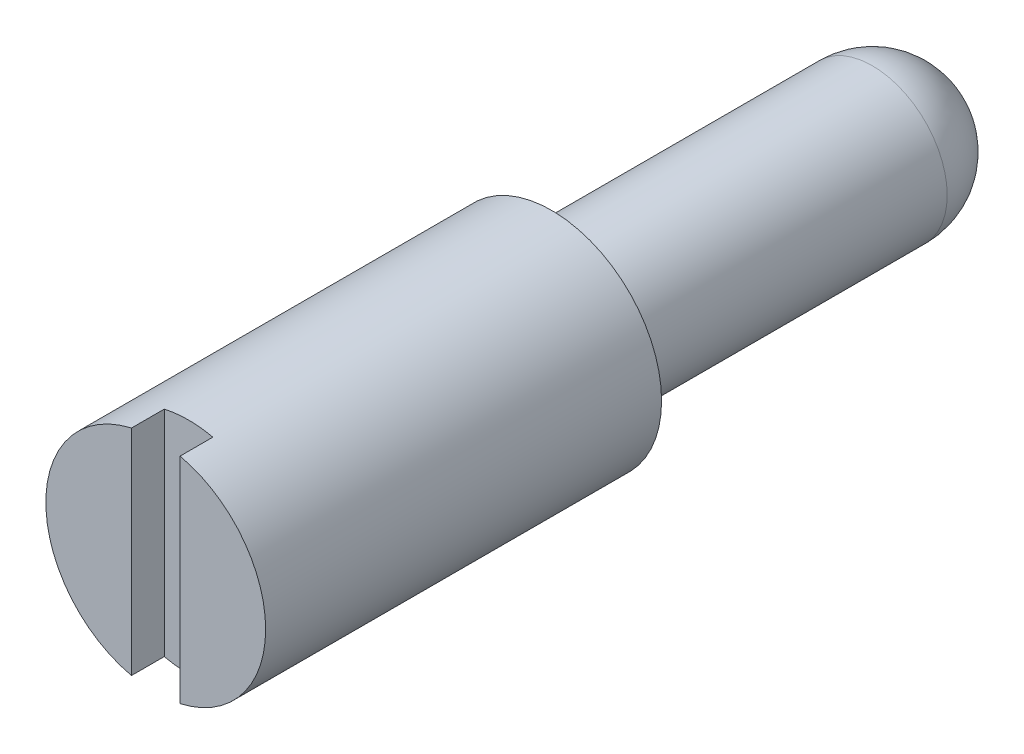
ISO-10303-21;
HEADER;
FILE_DESCRIPTION(('STEP AP214'),'2;1');
FILE_NAME('part.step','',(''),(''),'','','');
FILE_SCHEMA(('AUTOMOTIVE_DESIGN { 1 0 10303 214 1 1 1 1 }'));
ENDSEC;
DATA;
#1=APPLICATION_CONTEXT('core data for automotive mechanical design processes');
#2=APPLICATION_PROTOCOL_DEFINITION('international standard','automotive_design',2000,#1);
#3=PRODUCT_CONTEXT('',#1,'mechanical');
#4=PRODUCT('Part','Part','',(#3));
#5=PRODUCT_RELATED_PRODUCT_CATEGORY('part','',(#4));
#6=PRODUCT_DEFINITION_FORMATION('','',#4);
#7=PRODUCT_DEFINITION_CONTEXT('part definition',#1,'design');
#8=PRODUCT_DEFINITION('design','',#6,#7);
#9=PRODUCT_DEFINITION_SHAPE('','',#8);
#10=(LENGTH_UNIT() NAMED_UNIT(*) SI_UNIT(.MILLI.,.METRE.));
#11=(NAMED_UNIT(*) PLANE_ANGLE_UNIT() SI_UNIT($,.RADIAN.));
#12=(NAMED_UNIT(*) SI_UNIT($,.STERADIAN.) SOLID_ANGLE_UNIT());
#13=UNCERTAINTY_MEASURE_WITH_UNIT(LENGTH_MEASURE(1.E-05),#10,'distance_accuracy_value','');
#14=(GEOMETRIC_REPRESENTATION_CONTEXT(3) GLOBAL_UNCERTAINTY_ASSIGNED_CONTEXT((#13)) GLOBAL_UNIT_ASSIGNED_CONTEXT((#10,
#11,#12)) REPRESENTATION_CONTEXT('',''));
#15=CARTESIAN_POINT('',(0.,0.,0.));
#16=DIRECTION('',(0.,0.,1.));
#17=DIRECTION('',(1.,0.,0.));
#18=AXIS2_PLACEMENT_3D('',#15,#16,#17);
#19=CARTESIAN_POINT('',(0.,0.,0.));
#20=DIRECTION('',(0.,0.,1.));
#21=DIRECTION('',(1.,0.,0.));
#22=AXIS2_PLACEMENT_3D('',#19,#20,#21);
#23=PLANE('',#22);
#24=DIRECTION('',(0.,1.,0.));
#25=VECTOR('',#24,1.);
#26=CARTESIAN_POINT('',(-0.585,-2.64537992930195,0.));
#27=LINE('',#26,#25);
#28=CARTESIAN_POINT('',(-0.585,-2.57988565063523,0.));
#29=VERTEX_POINT('',#28);
#30=CARTESIAN_POINT('',(-0.585,2.57988565063523,0.));
#31=VERTEX_POINT('',#30);
#32=EDGE_CURVE('E99',#29,#31,#27,.T.);
#33=ORIENTED_EDGE('',*,*,#32,.T.);
#34=CARTESIAN_POINT('',(0.,0.,0.));
#35=DIRECTION('',(0.,0.,1.));
#36=DIRECTION('',(1.,0.,0.));
#37=AXIS2_PLACEMENT_3D('',#34,#35,#36);
#38=CIRCLE('',#37,2.64537992930195);
#39=EDGE_CURVE('E88',#31,#29,#38,.T.);
#40=ORIENTED_EDGE('',*,*,#39,.T.);
#41=EDGE_LOOP('',(#33,#40));
#42=FACE_BOUND('',#41,.T.);
#43=ADVANCED_FACE('F37',(#42),#23,.T.);
#44=CARTESIAN_POINT('',(0.,0.,-17.25));
#45=DIRECTION('',(0.,0.,1.));
#46=DIRECTION('',(1.,0.,0.));
#47=AXIS2_PLACEMENT_3D('',#44,#45,#46);
#48=SPHERICAL_SURFACE('',#47,1.8);
#49=CARTESIAN_POINT('',(0.,0.,-17.25));
#50=DIRECTION('',(0.,0.,1.));
#51=DIRECTION('',(1.,0.,0.));
#52=AXIS2_PLACEMENT_3D('',#49,#50,#51);
#53=CIRCLE('',#52,1.8);
#54=CARTESIAN_POINT('',(1.8,0.,-17.25));
#55=VERTEX_POINT('',#54);
#56=EDGE_CURVE('E104',#55,#55,#53,.T.);
#57=ORIENTED_EDGE('',*,*,#56,.F.);
#58=EDGE_LOOP('',(#57));
#59=FACE_BOUND('',#58,.T.);
#60=ADVANCED_FACE('F39',(#59),#48,.T.);
#61=DIRECTION('',(0.,1.,0.));
#62=VECTOR('',#61,1.);
#63=CARTESIAN_POINT('',(0.585,-2.64537992930195,0.));
#64=LINE('',#63,#62);
#65=CARTESIAN_POINT('',(0.585,-2.57988565063523,0.));
#66=VERTEX_POINT('',#65);
#67=CARTESIAN_POINT('',(0.585,2.57988565063523,0.));
#68=VERTEX_POINT('',#67);
#69=EDGE_CURVE('E93',#66,#68,#64,.T.);
#70=ORIENTED_EDGE('',*,*,#69,.F.);
#71=EDGE_CURVE('E113',#66,#68,#38,.T.);
#72=ORIENTED_EDGE('',*,*,#71,.T.);
#73=EDGE_LOOP('',(#70,#72));
#74=FACE_BOUND('',#73,.T.);
#75=ADVANCED_FACE('F117',(#74),#23,.T.);
#76=CARTESIAN_POINT('',(0.,0.,0.));
#77=DIRECTION('',(0.,0.,1.));
#78=DIRECTION('',(1.,0.,0.));
#79=AXIS2_PLACEMENT_3D('',#76,#77,#78);
#80=CYLINDRICAL_SURFACE('',#79,2.64537992930195);
#81=DIRECTION('',(0.,0.,1.));
#82=VECTOR('',#81,1.);
#83=CARTESIAN_POINT('',(-0.585,-2.57988565063523,0.));
#84=LINE('',#83,#82);
#85=CARTESIAN_POINT('',(-0.585,-2.57988565063523,-0.79));
#86=VERTEX_POINT('',#85);
#87=EDGE_CURVE('E11',#29,#86,#84,.F.);
#88=ORIENTED_EDGE('',*,*,#87,.F.);
#89=ORIENTED_EDGE('',*,*,#39,.F.);
#90=DIRECTION('',(0.,0.,1.));
#91=VECTOR('',#90,1.);
#92=CARTESIAN_POINT('',(-0.585,2.57988565063523,0.));
#93=LINE('',#92,#91);
#94=CARTESIAN_POINT('',(-0.585,2.57988565063523,-0.79));
#95=VERTEX_POINT('',#94);
#96=EDGE_CURVE('E60',#95,#31,#93,.T.);
#97=ORIENTED_EDGE('',*,*,#96,.F.);
#98=CARTESIAN_POINT('',(0.,0.,-0.79));
#99=DIRECTION('',(0.,0.,-1.));
#100=DIRECTION('',(-1.,0.,0.));
#101=AXIS2_PLACEMENT_3D('',#98,#99,#100);
#102=CIRCLE('',#101,2.64537992930195);
#103=CARTESIAN_POINT('',(0.585,2.57988565063523,-0.79));
#104=VERTEX_POINT('',#103);
#105=EDGE_CURVE('E79',#104,#95,#102,.F.);
#106=ORIENTED_EDGE('',*,*,#105,.F.);
#107=DIRECTION('',(0.,0.,1.));
#108=VECTOR('',#107,1.);
#109=CARTESIAN_POINT('',(0.585,2.57988565063523,0.));
#110=LINE('',#109,#108);
#111=EDGE_CURVE('E45',#68,#104,#110,.F.);
#112=ORIENTED_EDGE('',*,*,#111,.F.);
#113=ORIENTED_EDGE('',*,*,#71,.F.);
#114=DIRECTION('',(0.,0.,1.));
#115=VECTOR('',#114,1.);
#116=CARTESIAN_POINT('',(0.585,-2.57988565063523,0.));
#117=LINE('',#116,#115);
#118=CARTESIAN_POINT('',(0.585,-2.57988565063523,-0.79));
#119=VERTEX_POINT('',#118);
#120=EDGE_CURVE('E94',#119,#66,#117,.T.);
#121=ORIENTED_EDGE('',*,*,#120,.F.);
#122=EDGE_CURVE('E90',#86,#119,#102,.F.);
#123=ORIENTED_EDGE('',*,*,#122,.F.);
#124=EDGE_LOOP('',(#88,#89,#97,#106,#112,#113,#121,#123));
#125=FACE_BOUND('',#124,.T.);
#126=CARTESIAN_POINT('',(0.,0.,-9.53));
#127=DIRECTION('',(0.,0.,1.));
#128=DIRECTION('',(1.,0.,0.));
#129=AXIS2_PLACEMENT_3D('',#126,#127,#128);
#130=CIRCLE('',#129,2.64537992930195);
#131=CARTESIAN_POINT('',(2.64537992930195,0.,-9.53));
#132=VERTEX_POINT('',#131);
#133=EDGE_CURVE('E110',#132,#132,#130,.T.);
#134=ORIENTED_EDGE('',*,*,#133,.T.);
#135=EDGE_LOOP('',(#134));
#136=FACE_BOUND('',#135,.T.);
#137=ADVANCED_FACE('F81',(#125,#136),#80,.T.);
#138=CARTESIAN_POINT('',(2.64537992930195,0.,-9.53));
#139=DIRECTION('',(0.,0.,-1.));
#140=DIRECTION('',(-1.,0.,0.));
#141=AXIS2_PLACEMENT_3D('',#138,#139,#140);
#142=PLANE('',#141);
#143=CARTESIAN_POINT('',(0.,0.,-9.53));
#144=DIRECTION('',(0.,0.,1.));
#145=DIRECTION('',(1.,0.,0.));
#146=AXIS2_PLACEMENT_3D('',#143,#144,#145);
#147=CIRCLE('',#146,1.8);
#148=CARTESIAN_POINT('',(1.8,0.,-9.53));
#149=VERTEX_POINT('',#148);
#150=EDGE_CURVE('E107',#149,#149,#147,.T.);
#151=ORIENTED_EDGE('',*,*,#150,.T.);
#152=EDGE_LOOP('',(#151));
#153=FACE_BOUND('',#152,.T.);
#154=ORIENTED_EDGE('',*,*,#133,.F.);
#155=EDGE_LOOP('',(#154));
#156=FACE_BOUND('',#155,.T.);
#157=ADVANCED_FACE('F123',(#153,#156),#142,.T.);
#158=CARTESIAN_POINT('',(0.,0.,0.));
#159=DIRECTION('',(0.,0.,1.));
#160=DIRECTION('',(1.,0.,0.));
#161=AXIS2_PLACEMENT_3D('',#158,#159,#160);
#162=CYLINDRICAL_SURFACE('',#161,1.8);
#163=ORIENTED_EDGE('',*,*,#56,.T.);
#164=EDGE_LOOP('',(#163));
#165=FACE_BOUND('',#164,.T.);
#166=ORIENTED_EDGE('',*,*,#150,.F.);
#167=EDGE_LOOP('',(#166));
#168=FACE_BOUND('',#167,.T.);
#169=ADVANCED_FACE('F133',(#165,#168),#162,.T.);
#170=CARTESIAN_POINT('',(-0.585,-2.64537992930195,0.));
#171=DIRECTION('',(-1.,0.,0.));
#172=DIRECTION('',(0.,0.,1.));
#173=AXIS2_PLACEMENT_3D('',#170,#171,#172);
#174=PLANE('',#173);
#175=ORIENTED_EDGE('',*,*,#87,.T.);
#176=DIRECTION('',(0.,1.,0.));
#177=VECTOR('',#176,1.);
#178=CARTESIAN_POINT('',(-0.585,-2.64537992930195,-0.79));
#179=LINE('',#178,#177);
#180=EDGE_CURVE('E97',#86,#95,#179,.T.);
#181=ORIENTED_EDGE('',*,*,#180,.T.);
#182=ORIENTED_EDGE('',*,*,#96,.T.);
#183=ORIENTED_EDGE('',*,*,#32,.F.);
#184=EDGE_LOOP('',(#175,#181,#182,#183));
#185=FACE_BOUND('',#184,.T.);
#186=ADVANCED_FACE('F131',(#185),#174,.F.);
#187=CARTESIAN_POINT('',(-0.585,-2.64537992930195,-0.79));
#188=DIRECTION('',(0.,0.,-1.));
#189=DIRECTION('',(-1.,0.,0.));
#190=AXIS2_PLACEMENT_3D('',#187,#188,#189);
#191=PLANE('',#190);
#192=ORIENTED_EDGE('',*,*,#180,.F.);
#193=ORIENTED_EDGE('',*,*,#122,.T.);
#194=DIRECTION('',(0.,1.,0.));
#195=VECTOR('',#194,1.);
#196=CARTESIAN_POINT('',(0.585,-2.64537992930195,-0.79));
#197=LINE('',#196,#195);
#198=EDGE_CURVE('E52',#119,#104,#197,.T.);
#199=ORIENTED_EDGE('',*,*,#198,.T.);
#200=ORIENTED_EDGE('',*,*,#105,.T.);
#201=EDGE_LOOP('',(#192,#193,#199,#200));
#202=FACE_BOUND('',#201,.T.);
#203=ADVANCED_FACE('F95',(#202),#191,.F.);
#204=CARTESIAN_POINT('',(0.585,-2.64537992930195,-0.79));
#205=DIRECTION('',(1.,0.,0.));
#206=DIRECTION('',(0.,0.,-1.));
#207=AXIS2_PLACEMENT_3D('',#204,#205,#206);
#208=PLANE('',#207);
#209=ORIENTED_EDGE('',*,*,#111,.T.);
#210=ORIENTED_EDGE('',*,*,#198,.F.);
#211=ORIENTED_EDGE('',*,*,#120,.T.);
#212=ORIENTED_EDGE('',*,*,#69,.T.);
#213=EDGE_LOOP('',(#209,#210,#211,#212));
#214=FACE_BOUND('',#213,.T.);
#215=ADVANCED_FACE('F91',(#214),#208,.F.);
#216=CLOSED_SHELL('',(#43,#60,#75,#137,#157,#169,#186,#203,#215));
#217=MANIFOLD_SOLID_BREP('B2',#216);
#218=ADVANCED_BREP_SHAPE_REPRESENTATION('',(#18,#217),#14);
#219=SHAPE_DEFINITION_REPRESENTATION(#9,#218);
ENDSEC;
END-ISO-10303-21;
